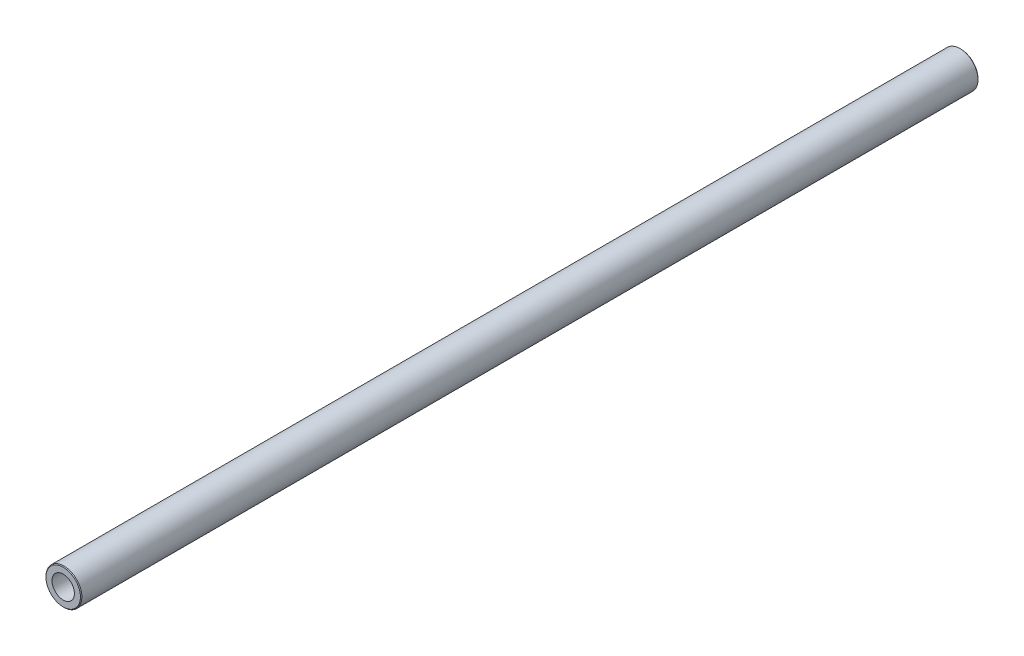
ISO-10303-21;
HEADER;
FILE_DESCRIPTION(('STEP AP214'),'2;1');
FILE_NAME('part.step','',(''),(''),'','','');
FILE_SCHEMA(('AUTOMOTIVE_DESIGN { 1 0 10303 214 1 1 1 1 }'));
ENDSEC;
DATA;
#1=APPLICATION_CONTEXT('core data for automotive mechanical design processes');
#2=APPLICATION_PROTOCOL_DEFINITION('international standard','automotive_design',2000,#1);
#3=PRODUCT_CONTEXT('',#1,'mechanical');
#4=PRODUCT('Part','Part','',(#3));
#5=PRODUCT_RELATED_PRODUCT_CATEGORY('part','',(#4));
#6=PRODUCT_DEFINITION_FORMATION('','',#4);
#7=PRODUCT_DEFINITION_CONTEXT('part definition',#1,'design');
#8=PRODUCT_DEFINITION('design','',#6,#7);
#9=PRODUCT_DEFINITION_SHAPE('','',#8);
#10=(LENGTH_UNIT() NAMED_UNIT(*) SI_UNIT(.MILLI.,.METRE.));
#11=(NAMED_UNIT(*) PLANE_ANGLE_UNIT() SI_UNIT($,.RADIAN.));
#12=(NAMED_UNIT(*) SI_UNIT($,.STERADIAN.) SOLID_ANGLE_UNIT());
#13=UNCERTAINTY_MEASURE_WITH_UNIT(LENGTH_MEASURE(1.E-05),#10,'distance_accuracy_value','');
#14=(GEOMETRIC_REPRESENTATION_CONTEXT(3) GLOBAL_UNCERTAINTY_ASSIGNED_CONTEXT((#13)) GLOBAL_UNIT_ASSIGNED_CONTEXT((#10,
#11,#12)) REPRESENTATION_CONTEXT('',''));
#15=CARTESIAN_POINT('',(0.,0.,0.));
#16=DIRECTION('',(0.,0.,1.));
#17=DIRECTION('',(1.,0.,0.));
#18=AXIS2_PLACEMENT_3D('',#15,#16,#17);
#19=CARTESIAN_POINT('',(0.,0.,100.));
#20=DIRECTION('',(0.,0.,-1.));
#21=DIRECTION('',(-1.,0.,0.));
#22=AXIS2_PLACEMENT_3D('',#19,#20,#21);
#23=CYLINDRICAL_SURFACE('',#22,4.);
#24=CARTESIAN_POINT('',(0.,0.,-99.84));
#25=DIRECTION('',(0.,0.,1.));
#26=DIRECTION('',(1.,0.,0.));
#27=AXIS2_PLACEMENT_3D('',#24,#25,#26);
#28=CIRCLE('',#27,4.);
#29=CARTESIAN_POINT('',(4.,0.,-99.84));
#30=VERTEX_POINT('',#29);
#31=EDGE_CURVE('E87',#30,#30,#28,.T.);
#32=ORIENTED_EDGE('',*,*,#31,.T.);
#33=EDGE_LOOP('',(#32));
#34=FACE_BOUND('',#33,.T.);
#35=CARTESIAN_POINT('',(0.,0.,99.84));
#36=DIRECTION('',(0.,0.,1.));
#37=DIRECTION('',(1.,0.,0.));
#38=AXIS2_PLACEMENT_3D('',#35,#36,#37);
#39=CIRCLE('',#38,4.);
#40=CARTESIAN_POINT('',(4.,0.,99.84));
#41=VERTEX_POINT('',#40);
#42=EDGE_CURVE('E83',#41,#41,#39,.F.);
#43=ORIENTED_EDGE('',*,*,#42,.T.);
#44=EDGE_LOOP('',(#43));
#45=FACE_BOUND('',#44,.T.);
#46=ADVANCED_FACE('F47',(#34,#45),#23,.T.);
#47=CARTESIAN_POINT('',(0.,0.,100.));
#48=DIRECTION('',(0.,0.,1.));
#49=DIRECTION('',(1.,0.,0.));
#50=AXIS2_PLACEMENT_3D('',#47,#48,#49);
#51=PLANE('',#50);
#52=CARTESIAN_POINT('',(0.,0.,100.));
#53=DIRECTION('',(0.,0.,1.));
#54=DIRECTION('',(1.,0.,0.));
#55=AXIS2_PLACEMENT_3D('',#52,#53,#54);
#56=CIRCLE('',#55,2.49999999999999);
#57=CARTESIAN_POINT('',(2.49999999999999,0.,100.));
#58=VERTEX_POINT('',#57);
#59=EDGE_CURVE('E73',#58,#58,#56,.T.);
#60=ORIENTED_EDGE('',*,*,#59,.F.);
#61=EDGE_LOOP('',(#60));
#62=FACE_BOUND('',#61,.T.);
#63=CARTESIAN_POINT('',(0.,0.,100.));
#64=DIRECTION('',(0.,0.,1.));
#65=DIRECTION('',(1.,0.,0.));
#66=AXIS2_PLACEMENT_3D('',#63,#64,#65);
#67=CIRCLE('',#66,3.84000000000001);
#68=CARTESIAN_POINT('',(3.84000000000001,0.,100.));
#69=VERTEX_POINT('',#68);
#70=EDGE_CURVE('E11',#69,#69,#67,.T.);
#71=ORIENTED_EDGE('',*,*,#70,.T.);
#72=EDGE_LOOP('',(#71));
#73=FACE_BOUND('',#72,.T.);
#74=ADVANCED_FACE('F104',(#62,#73),#51,.T.);
#75=CARTESIAN_POINT('',(0.,0.,-100.));
#76=DIRECTION('',(0.,0.,1.));
#77=DIRECTION('',(1.,0.,0.));
#78=AXIS2_PLACEMENT_3D('',#75,#76,#77);
#79=PLANE('',#78);
#80=CARTESIAN_POINT('',(0.,0.,-100.));
#81=DIRECTION('',(0.,0.,-1.));
#82=DIRECTION('',(-1.,0.,0.));
#83=AXIS2_PLACEMENT_3D('',#80,#81,#82);
#84=CIRCLE('',#83,2.49999999999999);
#85=CARTESIAN_POINT('',(-2.49999999999999,0.,-100.));
#86=VERTEX_POINT('',#85);
#87=EDGE_CURVE('E72',#86,#86,#84,.T.);
#88=ORIENTED_EDGE('',*,*,#87,.F.);
#89=EDGE_LOOP('',(#88));
#90=FACE_BOUND('',#89,.T.);
#91=CARTESIAN_POINT('',(0.,0.,-100.));
#92=DIRECTION('',(0.,0.,1.));
#93=DIRECTION('',(1.,0.,0.));
#94=AXIS2_PLACEMENT_3D('',#91,#92,#93);
#95=CIRCLE('',#94,3.84000000000004);
#96=CARTESIAN_POINT('',(3.84000000000004,0.,-100.));
#97=VERTEX_POINT('',#96);
#98=EDGE_CURVE('E56',#97,#97,#95,.F.);
#99=ORIENTED_EDGE('',*,*,#98,.T.);
#100=EDGE_LOOP('',(#99));
#101=FACE_BOUND('',#100,.T.);
#102=ADVANCED_FACE('F95',(#90,#101),#79,.F.);
#103=CARTESIAN_POINT('',(0.,0.,-99.84));
#104=DIRECTION('',(0.,0.,1.));
#105=DIRECTION('',(1.,0.,0.));
#106=AXIS2_PLACEMENT_3D('',#103,#104,#105);
#107=CONICAL_SURFACE('',#106,4.,0.785398163397351);
#108=ORIENTED_EDGE('',*,*,#98,.F.);
#109=EDGE_LOOP('',(#108));
#110=FACE_BOUND('',#109,.T.);
#111=ORIENTED_EDGE('',*,*,#31,.F.);
#112=EDGE_LOOP('',(#111));
#113=FACE_BOUND('',#112,.T.);
#114=ADVANCED_FACE('F97',(#110,#113),#107,.T.);
#115=CARTESIAN_POINT('',(0.,0.,100.));
#116=DIRECTION('',(0.,0.,-1.));
#117=DIRECTION('',(-1.,0.,0.));
#118=AXIS2_PLACEMENT_3D('',#115,#116,#117);
#119=CONICAL_SURFACE('',#118,3.84000000000001,0.785398163397351);
#120=ORIENTED_EDGE('',*,*,#42,.F.);
#121=EDGE_LOOP('',(#120));
#122=FACE_BOUND('',#121,.T.);
#123=ORIENTED_EDGE('',*,*,#70,.F.);
#124=EDGE_LOOP('',(#123));
#125=FACE_BOUND('',#124,.T.);
#126=ADVANCED_FACE('F49',(#122,#125),#119,.T.);
#127=CARTESIAN_POINT('',(0.,0.,-75.));
#128=DIRECTION('',(0.,0.,-1.));
#129=DIRECTION('',(-1.,0.,0.));
#130=AXIS2_PLACEMENT_3D('',#127,#128,#129);
#131=CONICAL_SURFACE('',#130,2.49999999999999,1.02974425867665);
#132=CARTESIAN_POINT('',(0.,0.,-73.4978484524311));
#133=VERTEX_POINT('',#132);
#134=VERTEX_LOOP('',#133);
#135=FACE_BOUND('',#134,.T.);
#136=CARTESIAN_POINT('',(0.,0.,-75.));
#137=DIRECTION('',(0.,0.,-1.));
#138=DIRECTION('',(-1.,0.,0.));
#139=AXIS2_PLACEMENT_3D('',#136,#137,#138);
#140=CIRCLE('',#139,2.49999999999999);
#141=CARTESIAN_POINT('',(-2.49999999999999,0.,-75.));
#142=VERTEX_POINT('',#141);
#143=EDGE_CURVE('E76',#142,#142,#140,.T.);
#144=ORIENTED_EDGE('',*,*,#143,.T.);
#145=EDGE_LOOP('',(#144));
#146=FACE_BOUND('',#145,.T.);
#147=ADVANCED_FACE('F110',(#135,#146),#131,.F.);
#148=CARTESIAN_POINT('',(0.,0.,-100.));
#149=DIRECTION('',(0.,0.,-1.));
#150=DIRECTION('',(-1.,0.,0.));
#151=AXIS2_PLACEMENT_3D('',#148,#149,#150);
#152=CYLINDRICAL_SURFACE('',#151,2.49999999999999);
#153=ORIENTED_EDGE('',*,*,#143,.F.);
#154=EDGE_LOOP('',(#153));
#155=FACE_BOUND('',#154,.T.);
#156=ORIENTED_EDGE('',*,*,#87,.T.);
#157=EDGE_LOOP('',(#156));
#158=FACE_BOUND('',#157,.T.);
#159=ADVANCED_FACE('F66',(#155,#158),#152,.F.);
#160=CARTESIAN_POINT('',(0.,0.,75.));
#161=DIRECTION('',(0.,0.,1.));
#162=DIRECTION('',(1.,0.,0.));
#163=AXIS2_PLACEMENT_3D('',#160,#161,#162);
#164=CONICAL_SURFACE('',#163,2.49999999999999,1.02974425867665);
#165=CARTESIAN_POINT('',(0.,0.,73.4978484524311));
#166=VERTEX_POINT('',#165);
#167=VERTEX_LOOP('',#166);
#168=FACE_BOUND('',#167,.T.);
#169=CARTESIAN_POINT('',(0.,0.,75.));
#170=DIRECTION('',(0.,0.,1.));
#171=DIRECTION('',(1.,0.,0.));
#172=AXIS2_PLACEMENT_3D('',#169,#170,#171);
#173=CIRCLE('',#172,2.49999999999999);
#174=CARTESIAN_POINT('',(2.49999999999999,0.,75.));
#175=VERTEX_POINT('',#174);
#176=EDGE_CURVE('E70',#175,#175,#173,.T.);
#177=ORIENTED_EDGE('',*,*,#176,.T.);
#178=EDGE_LOOP('',(#177));
#179=FACE_BOUND('',#178,.T.);
#180=ADVANCED_FACE('F62',(#168,#179),#164,.F.);
#181=CARTESIAN_POINT('',(0.,0.,100.));
#182=DIRECTION('',(0.,0.,1.));
#183=DIRECTION('',(1.,0.,0.));
#184=AXIS2_PLACEMENT_3D('',#181,#182,#183);
#185=CYLINDRICAL_SURFACE('',#184,2.49999999999999);
#186=ORIENTED_EDGE('',*,*,#176,.F.);
#187=EDGE_LOOP('',(#186));
#188=FACE_BOUND('',#187,.T.);
#189=ORIENTED_EDGE('',*,*,#59,.T.);
#190=EDGE_LOOP('',(#189));
#191=FACE_BOUND('',#190,.T.);
#192=ADVANCED_FACE('F65',(#188,#191),#185,.F.);
#193=CLOSED_SHELL('',(#46,#74,#102,#114,#126,#147,#159,#180,#192));
#194=MANIFOLD_SOLID_BREP('B2',#193);
#195=ADVANCED_BREP_SHAPE_REPRESENTATION('',(#18,#194),#14);
#196=SHAPE_DEFINITION_REPRESENTATION(#9,#195);
ENDSEC;
END-ISO-10303-21;
